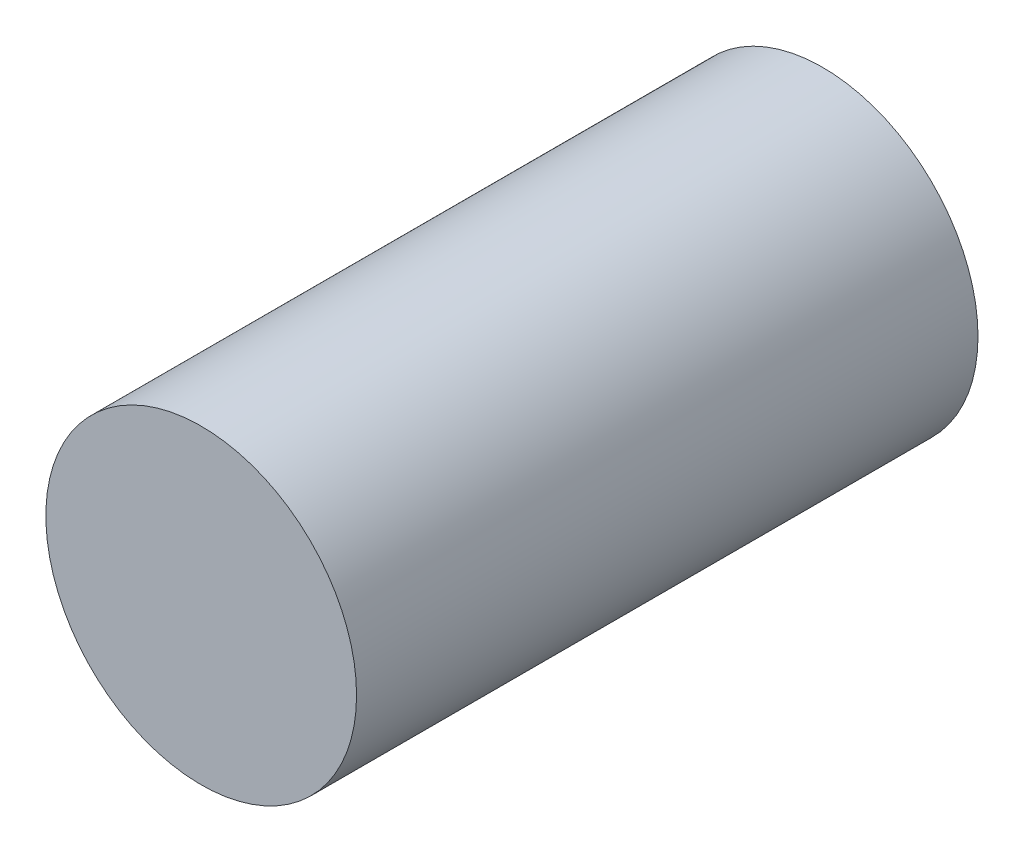
ISO-10303-21;
HEADER;
FILE_DESCRIPTION(('STEP AP214'),'2;1');
FILE_NAME('part.step','',(''),(''),'','','');
FILE_SCHEMA(('AUTOMOTIVE_DESIGN { 1 0 10303 214 1 1 1 1 }'));
ENDSEC;
DATA;
#1=APPLICATION_CONTEXT('core data for automotive mechanical design processes');
#2=APPLICATION_PROTOCOL_DEFINITION('international standard','automotive_design',2000,#1);
#3=PRODUCT_CONTEXT('',#1,'mechanical');
#4=PRODUCT('Part','Part','',(#3));
#5=PRODUCT_RELATED_PRODUCT_CATEGORY('part','',(#4));
#6=PRODUCT_DEFINITION_FORMATION('','',#4);
#7=PRODUCT_DEFINITION_CONTEXT('part definition',#1,'design');
#8=PRODUCT_DEFINITION('design','',#6,#7);
#9=PRODUCT_DEFINITION_SHAPE('','',#8);
#10=(LENGTH_UNIT() NAMED_UNIT(*) SI_UNIT(.MILLI.,.METRE.));
#11=(NAMED_UNIT(*) PLANE_ANGLE_UNIT() SI_UNIT($,.RADIAN.));
#12=(NAMED_UNIT(*) SI_UNIT($,.STERADIAN.) SOLID_ANGLE_UNIT());
#13=UNCERTAINTY_MEASURE_WITH_UNIT(LENGTH_MEASURE(1.E-05),#10,'distance_accuracy_value','');
#14=(GEOMETRIC_REPRESENTATION_CONTEXT(3) GLOBAL_UNCERTAINTY_ASSIGNED_CONTEXT((#13)) GLOBAL_UNIT_ASSIGNED_CONTEXT((#10,
#11,#12)) REPRESENTATION_CONTEXT('',''));
#15=CARTESIAN_POINT('',(0.,0.,0.));
#16=DIRECTION('',(0.,0.,1.));
#17=DIRECTION('',(1.,0.,0.));
#18=AXIS2_PLACEMENT_3D('',#15,#16,#17);
#19=CARTESIAN_POINT('',(0.,0.,200.));
#20=DIRECTION('',(0.,0.,-1.));
#21=DIRECTION('',(-1.,0.,0.));
#22=AXIS2_PLACEMENT_3D('',#19,#20,#21);
#23=CYLINDRICAL_SURFACE('',#22,50.);
#24=CARTESIAN_POINT('',(0.,0.,200.));
#25=DIRECTION('',(0.,0.,1.));
#26=DIRECTION('',(1.,0.,0.));
#27=AXIS2_PLACEMENT_3D('',#24,#25,#26);
#28=CIRCLE('',#27,50.);
#29=CARTESIAN_POINT('',(50.,0.,200.));
#30=VERTEX_POINT('',#29);
#31=EDGE_CURVE('E10',#30,#30,#28,.T.);
#32=ORIENTED_EDGE('',*,*,#31,.F.);
#33=EDGE_LOOP('',(#32));
#34=FACE_BOUND('',#33,.T.);
#35=CARTESIAN_POINT('',(0.,0.,0.));
#36=DIRECTION('',(0.,0.,1.));
#37=DIRECTION('',(1.,0.,0.));
#38=AXIS2_PLACEMENT_3D('',#35,#36,#37);
#39=CIRCLE('',#38,50.);
#40=CARTESIAN_POINT('',(50.,0.,0.));
#41=VERTEX_POINT('',#40);
#42=EDGE_CURVE('E34',#41,#41,#39,.T.);
#43=ORIENTED_EDGE('',*,*,#42,.T.);
#44=EDGE_LOOP('',(#43));
#45=FACE_BOUND('',#44,.T.);
#46=ADVANCED_FACE('F31',(#34,#45),#23,.T.);
#47=CARTESIAN_POINT('',(0.,0.,200.));
#48=DIRECTION('',(0.,0.,1.));
#49=DIRECTION('',(1.,0.,0.));
#50=AXIS2_PLACEMENT_3D('',#47,#48,#49);
#51=PLANE('',#50);
#52=ORIENTED_EDGE('',*,*,#31,.T.);
#53=EDGE_LOOP('',(#52));
#54=FACE_BOUND('',#53,.T.);
#55=ADVANCED_FACE('F46',(#54),#51,.T.);
#56=CARTESIAN_POINT('',(0.,0.,0.));
#57=DIRECTION('',(0.,0.,1.));
#58=DIRECTION('',(1.,0.,0.));
#59=AXIS2_PLACEMENT_3D('',#56,#57,#58);
#60=PLANE('',#59);
#61=ORIENTED_EDGE('',*,*,#42,.F.);
#62=EDGE_LOOP('',(#61));
#63=FACE_BOUND('',#62,.T.);
#64=ADVANCED_FACE('F44',(#63),#60,.F.);
#65=CLOSED_SHELL('',(#46,#55,#64));
#66=MANIFOLD_SOLID_BREP('B2',#65);
#67=ADVANCED_BREP_SHAPE_REPRESENTATION('',(#18,#66),#14);
#68=SHAPE_DEFINITION_REPRESENTATION(#9,#67);
ENDSEC;
END-ISO-10303-21;
